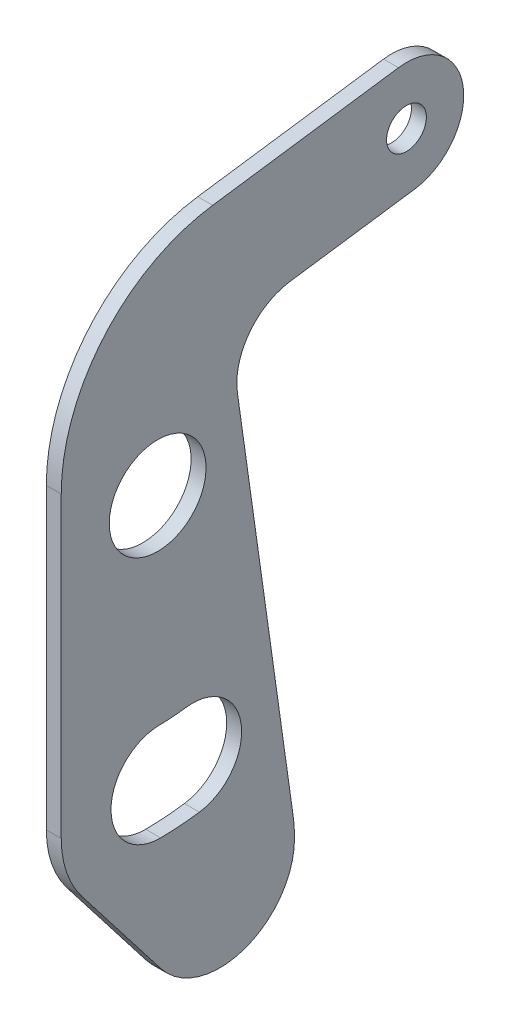
ISO-10303-21;
HEADER;
FILE_DESCRIPTION(('STEP AP214'),'2;1');
FILE_NAME('part.step','',(''),(''),'','','');
FILE_SCHEMA(('AUTOMOTIVE_DESIGN { 1 0 10303 214 1 1 1 1 }'));
ENDSEC;
DATA;
#1=APPLICATION_CONTEXT('core data for automotive mechanical design processes');
#2=APPLICATION_PROTOCOL_DEFINITION('international standard','automotive_design',2000,#1);
#3=PRODUCT_CONTEXT('',#1,'mechanical');
#4=PRODUCT('Part','Part','',(#3));
#5=PRODUCT_RELATED_PRODUCT_CATEGORY('part','',(#4));
#6=PRODUCT_DEFINITION_FORMATION('','',#4);
#7=PRODUCT_DEFINITION_CONTEXT('part definition',#1,'design');
#8=PRODUCT_DEFINITION('design','',#6,#7);
#9=PRODUCT_DEFINITION_SHAPE('','',#8);
#10=(LENGTH_UNIT() NAMED_UNIT(*) SI_UNIT(.MILLI.,.METRE.));
#11=(NAMED_UNIT(*) PLANE_ANGLE_UNIT() SI_UNIT($,.RADIAN.));
#12=(NAMED_UNIT(*) SI_UNIT($,.STERADIAN.) SOLID_ANGLE_UNIT());
#13=UNCERTAINTY_MEASURE_WITH_UNIT(LENGTH_MEASURE(1.E-05),#10,'distance_accuracy_value','');
#14=(GEOMETRIC_REPRESENTATION_CONTEXT(3) GLOBAL_UNCERTAINTY_ASSIGNED_CONTEXT((#13)) GLOBAL_UNIT_ASSIGNED_CONTEXT((#10,
#11,#12)) REPRESENTATION_CONTEXT('',''));
#15=CARTESIAN_POINT('',(0.,0.,0.));
#16=DIRECTION('',(0.,0.,1.));
#17=DIRECTION('',(1.,0.,0.));
#18=AXIS2_PLACEMENT_3D('',#15,#16,#17);
#19=CARTESIAN_POINT('',(1.524,-37.3168516753459,-6.35));
#20=DIRECTION('',(1.,0.,0.));
#21=DIRECTION('',(0.,0.,-1.));
#22=AXIS2_PLACEMENT_3D('',#19,#20,#21);
#23=PLANE('',#22);
#24=CARTESIAN_POINT('',(1.524,0.,0.));
#25=DIRECTION('',(1.,0.,0.));
#26=DIRECTION('',(0.,0.,-1.));
#27=AXIS2_PLACEMENT_3D('',#24,#25,#26);
#28=CIRCLE('',#27,30.4165);
#29=CARTESIAN_POINT('',(1.524,-30.414979175,-0.304161197913728));
#30=VERTEX_POINT('',#29);
#31=CARTESIAN_POINT('',(1.524,-30.1168569667699,-4.25891989747662));
#32=VERTEX_POINT('',#31);
#33=EDGE_CURVE('E152',#30,#32,#28,.T.);
#34=ORIENTED_EDGE('',*,*,#33,.F.);
#35=CARTESIAN_POINT('',(1.524,-25.39873,-0.253996824980157));
#36=DIRECTION('',(1.,0.,0.));
#37=DIRECTION('',(0.,0.,-1.));
#38=AXIS2_PLACEMENT_3D('',#35,#36,#37);
#39=CIRCLE('',#38,5.0165);
#40=CARTESIAN_POINT('',(1.524,-20.382480825,-0.203832452046569));
#41=VERTEX_POINT('',#40);
#42=EDGE_CURVE('E142',#41,#30,#39,.T.);
#43=ORIENTED_EDGE('',*,*,#42,.F.);
#44=CARTESIAN_POINT('',(1.524,0.,0.));
#45=DIRECTION('',(-1.,0.,0.));
#46=DIRECTION('',(0.,0.,-1.));
#47=AXIS2_PLACEMENT_3D('',#44,#45,#46);
#48=CIRCLE('',#47,20.3835);
#49=CARTESIAN_POINT('',(1.524,-20.1826953785661,-2.8540987204384));
#50=VERTEX_POINT('',#49);
#51=EDGE_CURVE('E168',#50,#41,#48,.T.);
#52=ORIENTED_EDGE('',*,*,#51,.F.);
#53=CARTESIAN_POINT('',(1.524,-25.149776172668,-3.55650930895751));
#54=DIRECTION('',(1.,0.,0.));
#55=DIRECTION('',(0.,0.,-1.));
#56=AXIS2_PLACEMENT_3D('',#53,#54,#55);
#57=CIRCLE('',#56,5.0165);
#58=EDGE_CURVE('E166',#32,#50,#57,.T.);
#59=ORIENTED_EDGE('',*,*,#58,.F.);
#60=EDGE_LOOP('',(#34,#43,#52,#59));
#61=FACE_BOUND('',#60,.T.);
#62=CARTESIAN_POINT('',(1.524,0.,0.));
#63=DIRECTION('',(1.,0.,0.));
#64=DIRECTION('',(0.,0.,-1.));
#65=AXIS2_PLACEMENT_3D('',#62,#63,#64);
#66=CIRCLE('',#65,4.9403);
#67=CARTESIAN_POINT('',(1.524,0.,4.9403));
#68=VERTEX_POINT('',#67);
#69=EDGE_CURVE('E186',#68,#68,#66,.T.);
#70=ORIENTED_EDGE('',*,*,#69,.F.);
#71=EDGE_LOOP('',(#70));
#72=FACE_BOUND('',#71,.T.);
#73=CARTESIAN_POINT('',(1.524,-37.3168516753459,-6.35));
#74=DIRECTION('',(1.,0.,0.));
#75=DIRECTION('',(0.,0.,-1.));
#76=AXIS2_PLACEMENT_3D('',#73,#74,#75);
#77=CIRCLE('',#76,7.62);
#78=CARTESIAN_POINT('',(1.524,-41.9819776295705,-0.324968893754983));
#79=VERTEX_POINT('',#78);
#80=CARTESIAN_POINT('',(1.524,-37.3168516753459,-13.97));
#81=VERTEX_POINT('',#80);
#82=EDGE_CURVE('E192',#79,#81,#77,.T.);
#83=ORIENTED_EDGE('',*,*,#82,.T.);
#84=CARTESIAN_POINT('',(1.524,-37.3168516753459,1.83807581099768));
#85=DIRECTION('',(1.,0.,0.));
#86=DIRECTION('',(0.,0.,-1.));
#87=AXIS2_PLACEMENT_3D('',#84,#85,#86);
#88=CIRCLE('',#87,15.8080758109977);
#89=CARTESIAN_POINT('',(1.524,-35.1034040856405,-13.8142694003078));
#90=VERTEX_POINT('',#89);
#91=EDGE_CURVE('E195',#81,#90,#88,.T.);
#92=ORIENTED_EDGE('',*,*,#91,.T.);
#93=DIRECTION('',(0.,0.990148668215275,0.14002005153376));
#94=VECTOR('',#93,1.);
#95=CARTESIAN_POINT('',(1.524,-35.1034040856405,-13.8142694003078));
#96=LINE('',#95,#94);
#97=CARTESIAN_POINT('',(1.524,4.99946213749055,-8.14319638322683));
#98=VERTEX_POINT('',#97);
#99=EDGE_CURVE('E198',#90,#98,#96,.T.);
#100=ORIENTED_EDGE('',*,*,#99,.T.);
#101=CARTESIAN_POINT('',(1.524,5.88858946472992,-14.4306404263938));
#102=DIRECTION('',(1.,0.,0.));
#103=DIRECTION('',(0.,0.,-1.));
#104=AXIS2_PLACEMENT_3D('',#101,#102,#103);
#105=CIRCLE('',#104,6.35);
#106=CARTESIAN_POINT('',(1.524,12.1760335078969,-13.5415130991545));
#107=VERTEX_POINT('',#106);
#108=EDGE_CURVE('E11',#98,#107,#105,.F.);
#109=ORIENTED_EDGE('',*,*,#108,.T.);
#110=DIRECTION('',(0.,0.14002005153376,-0.990148668215275));
#111=VECTOR('',#110,1.);
#112=CARTESIAN_POINT('',(1.524,11.2869061806575,-7.25406905598745));
#113=LINE('',#112,#111);
#114=CARTESIAN_POINT('',(1.524,13.9686551674441,-26.2179971410602));
#115=VERTEX_POINT('',#114);
#116=EDGE_CURVE('E200',#107,#115,#113,.T.);
#117=ORIENTED_EDGE('',*,*,#116,.T.);
#118=CARTESIAN_POINT('',(1.524,19.7531036871578,-25.4));
#119=DIRECTION('',(1.,0.,0.));
#120=DIRECTION('',(0.,0.,-1.));
#121=AXIS2_PLACEMENT_3D('',#118,#119,#120);
#122=CIRCLE('',#121,5.842);
#123=CARTESIAN_POINT('',(1.524,25.5375522068714,-24.5820028589398));
#124=VERTEX_POINT('',#123);
#125=EDGE_CURVE('E202',#115,#124,#122,.T.);
#126=ORIENTED_EDGE('',*,*,#125,.T.);
#127=DIRECTION('',(0.,-0.14002005153376,0.990148668215275));
#128=VECTOR('',#127,1.);
#129=CARTESIAN_POINT('',(1.524,25.5375522068714,-24.5820028589398));
#130=LINE('',#129,#128);
#131=CARTESIAN_POINT('',(1.524,22.8558032200848,-5.618074773867));
#132=VERTEX_POINT('',#131);
#133=EDGE_CURVE('E204',#124,#132,#130,.T.);
#134=ORIENTED_EDGE('',*,*,#133,.T.);
#135=CARTESIAN_POINT('',(1.524,5.0550734551283,-8.13533221109646));
#136=DIRECTION('',(1.,0.,0.));
#137=DIRECTION('',(0.,0.,1.));
#138=AXIS2_PLACEMENT_3D('',#135,#136,#137);
#139=CIRCLE('',#138,17.9778353861163);
#140=CARTESIAN_POINT('',(1.524,5.0550734551283,9.84250317501984));
#141=VERTEX_POINT('',#140);
#142=EDGE_CURVE('E206',#132,#141,#139,.T.);
#143=ORIENTED_EDGE('',*,*,#142,.T.);
#144=DIRECTION('',(0.,-1.,0.));
#145=VECTOR('',#144,1.);
#146=CARTESIAN_POINT('',(1.524,-25.39873,9.84250317501984));
#147=LINE('',#146,#145);
#148=CARTESIAN_POINT('',(1.524,-25.39873,9.84250317501985));
#149=VERTEX_POINT('',#148);
#150=EDGE_CURVE('E208',#141,#149,#147,.T.);
#151=ORIENTED_EDGE('',*,*,#150,.T.);
#152=CARTESIAN_POINT('',(1.524,-25.39873,-0.253996824980157));
#153=DIRECTION('',(1.,0.,0.));
#154=DIRECTION('',(0.,0.,-1.));
#155=AXIS2_PLACEMENT_3D('',#152,#153,#154);
#156=CIRCLE('',#155,10.0965);
#157=CARTESIAN_POINT('',(1.524,-31.5800218893476,7.7291693907945));
#158=VERTEX_POINT('',#157);
#159=EDGE_CURVE('E210',#149,#158,#156,.T.);
#160=ORIENTED_EDGE('',*,*,#159,.T.);
#161=DIRECTION('',(0.,-0.790686496882549,-0.612221253835248));
#162=VECTOR('',#161,1.);
#163=CARTESIAN_POINT('',(1.524,-41.9819776295705,-0.324968893754983));
#164=LINE('',#163,#162);
#165=EDGE_CURVE('E212',#158,#79,#164,.T.);
#166=ORIENTED_EDGE('',*,*,#165,.T.);
#167=EDGE_LOOP('',(#83,#92,#100,#109,#117,#126,#134,#143,#151,#160,#166));
#168=FACE_BOUND('',#167,.T.);
#169=CARTESIAN_POINT('',(1.524,19.7531036871578,-25.4));
#170=DIRECTION('',(1.,0.,0.));
#171=DIRECTION('',(0.,0.,-1.));
#172=AXIS2_PLACEMENT_3D('',#169,#170,#171);
#173=CIRCLE('',#172,2.032);
#174=CARTESIAN_POINT('',(1.524,19.7531036871578,-23.368));
#175=VERTEX_POINT('',#174);
#176=EDGE_CURVE('E175',#175,#175,#173,.T.);
#177=ORIENTED_EDGE('',*,*,#176,.F.);
#178=EDGE_LOOP('',(#177));
#179=FACE_BOUND('',#178,.T.);
#180=ADVANCED_FACE('F34',(#61,#72,#168,#179),#23,.T.);
#181=CARTESIAN_POINT('',(0.,-37.3168516753459,-6.35));
#182=DIRECTION('',(1.,0.,0.));
#183=DIRECTION('',(0.,0.,-1.));
#184=AXIS2_PLACEMENT_3D('',#181,#182,#183);
#185=PLANE('',#184);
#186=CARTESIAN_POINT('',(0.,0.,0.));
#187=DIRECTION('',(1.,0.,0.));
#188=DIRECTION('',(0.,0.,-1.));
#189=AXIS2_PLACEMENT_3D('',#186,#187,#188);
#190=CIRCLE('',#189,4.9403);
#191=CARTESIAN_POINT('',(0.,0.,4.9403));
#192=VERTEX_POINT('',#191);
#193=EDGE_CURVE('E160',#192,#192,#190,.T.);
#194=ORIENTED_EDGE('',*,*,#193,.T.);
#195=EDGE_LOOP('',(#194));
#196=FACE_BOUND('',#195,.T.);
#197=CARTESIAN_POINT('',(0.,-37.3168516753459,-6.35));
#198=DIRECTION('',(1.,0.,0.));
#199=DIRECTION('',(0.,0.,-1.));
#200=AXIS2_PLACEMENT_3D('',#197,#198,#199);
#201=CIRCLE('',#200,7.62);
#202=CARTESIAN_POINT('',(0.,-41.9819776295705,-0.324968893754983));
#203=VERTEX_POINT('',#202);
#204=CARTESIAN_POINT('',(0.,-37.3168516753459,-13.97));
#205=VERTEX_POINT('',#204);
#206=EDGE_CURVE('E189',#203,#205,#201,.T.);
#207=ORIENTED_EDGE('',*,*,#206,.F.);
#208=DIRECTION('',(0.,-0.790686496882549,-0.612221253835248));
#209=VECTOR('',#208,1.);
#210=CARTESIAN_POINT('',(0.,-41.9819776295705,-0.324968893754983));
#211=LINE('',#210,#209);
#212=CARTESIAN_POINT('',(0.,-31.5800218893476,7.7291693907945));
#213=VERTEX_POINT('',#212);
#214=EDGE_CURVE('E196',#213,#203,#211,.T.);
#215=ORIENTED_EDGE('',*,*,#214,.F.);
#216=CARTESIAN_POINT('',(0.,-25.39873,-0.253996824980157));
#217=DIRECTION('',(1.,0.,0.));
#218=DIRECTION('',(0.,0.,-1.));
#219=AXIS2_PLACEMENT_3D('',#216,#217,#218);
#220=CIRCLE('',#219,10.0965);
#221=CARTESIAN_POINT('',(0.,-25.39873,9.84250317501985));
#222=VERTEX_POINT('',#221);
#223=EDGE_CURVE('E231',#222,#213,#220,.T.);
#224=ORIENTED_EDGE('',*,*,#223,.F.);
#225=DIRECTION('',(0.,-1.,0.));
#226=VECTOR('',#225,1.);
#227=CARTESIAN_POINT('',(0.,-25.39873,9.84250317501984));
#228=LINE('',#227,#226);
#229=CARTESIAN_POINT('',(0.,5.0550734551283,9.84250317501984));
#230=VERTEX_POINT('',#229);
#231=EDGE_CURVE('E229',#230,#222,#228,.T.);
#232=ORIENTED_EDGE('',*,*,#231,.F.);
#233=CARTESIAN_POINT('',(0.,5.0550734551283,-8.13533221109646));
#234=DIRECTION('',(1.,0.,0.));
#235=DIRECTION('',(0.,0.,1.));
#236=AXIS2_PLACEMENT_3D('',#233,#234,#235);
#237=CIRCLE('',#236,17.9778353861163);
#238=CARTESIAN_POINT('',(0.,22.8558032200848,-5.618074773867));
#239=VERTEX_POINT('',#238);
#240=EDGE_CURVE('E227',#239,#230,#237,.T.);
#241=ORIENTED_EDGE('',*,*,#240,.F.);
#242=DIRECTION('',(0.,-0.14002005153376,0.990148668215275));
#243=VECTOR('',#242,1.);
#244=CARTESIAN_POINT('',(0.,25.5375522068714,-24.5820028589398));
#245=LINE('',#244,#243);
#246=CARTESIAN_POINT('',(0.,25.5375522068714,-24.5820028589398));
#247=VERTEX_POINT('',#246);
#248=EDGE_CURVE('E225',#247,#239,#245,.T.);
#249=ORIENTED_EDGE('',*,*,#248,.F.);
#250=CARTESIAN_POINT('',(0.,19.7531036871578,-25.4));
#251=DIRECTION('',(1.,0.,0.));
#252=DIRECTION('',(0.,0.,-1.));
#253=AXIS2_PLACEMENT_3D('',#250,#251,#252);
#254=CIRCLE('',#253,5.842);
#255=CARTESIAN_POINT('',(0.,13.9686551674441,-26.2179971410602));
#256=VERTEX_POINT('',#255);
#257=EDGE_CURVE('E223',#256,#247,#254,.T.);
#258=ORIENTED_EDGE('',*,*,#257,.F.);
#259=DIRECTION('',(0.,0.14002005153376,-0.990148668215275));
#260=VECTOR('',#259,1.);
#261=CARTESIAN_POINT('',(0.,11.2869061806575,-7.25406905598745));
#262=LINE('',#261,#260);
#263=CARTESIAN_POINT('',(0.,12.1760335078969,-13.5415130991545));
#264=VERTEX_POINT('',#263);
#265=EDGE_CURVE('E221',#264,#256,#262,.T.);
#266=ORIENTED_EDGE('',*,*,#265,.F.);
#267=CARTESIAN_POINT('',(0.,5.88858946472992,-14.4306404263938));
#268=DIRECTION('',(1.,0.,0.));
#269=DIRECTION('',(0.,0.,-1.));
#270=AXIS2_PLACEMENT_3D('',#267,#268,#269);
#271=CIRCLE('',#270,6.35);
#272=CARTESIAN_POINT('',(0.,4.99946213749055,-8.14319638322683));
#273=VERTEX_POINT('',#272);
#274=EDGE_CURVE('E42',#264,#273,#271,.T.);
#275=ORIENTED_EDGE('',*,*,#274,.T.);
#276=DIRECTION('',(0.,0.990148668215275,0.14002005153376));
#277=VECTOR('',#276,1.);
#278=CARTESIAN_POINT('',(0.,-35.1034040856405,-13.8142694003078));
#279=LINE('',#278,#277);
#280=CARTESIAN_POINT('',(0.,-35.1034040856405,-13.8142694003078));
#281=VERTEX_POINT('',#280);
#282=EDGE_CURVE('E219',#281,#273,#279,.T.);
#283=ORIENTED_EDGE('',*,*,#282,.F.);
#284=CARTESIAN_POINT('',(0.,-37.3168516753459,1.83807581099768));
#285=DIRECTION('',(1.,0.,0.));
#286=DIRECTION('',(0.,0.,-1.));
#287=AXIS2_PLACEMENT_3D('',#284,#285,#286);
#288=CIRCLE('',#287,15.8080758109977);
#289=EDGE_CURVE('E217',#205,#281,#288,.T.);
#290=ORIENTED_EDGE('',*,*,#289,.F.);
#291=EDGE_LOOP('',(#207,#215,#224,#232,#241,#249,#258,#266,#275,#283,#290));
#292=FACE_BOUND('',#291,.T.);
#293=CARTESIAN_POINT('',(0.,-25.39873,-0.253996824980157));
#294=DIRECTION('',(1.,0.,0.));
#295=DIRECTION('',(0.,0.,-1.));
#296=AXIS2_PLACEMENT_3D('',#293,#294,#295);
#297=CIRCLE('',#296,5.0165);
#298=CARTESIAN_POINT('',(0.,-20.382480825,-0.203832452046569));
#299=VERTEX_POINT('',#298);
#300=CARTESIAN_POINT('',(0.,-30.414979175,-0.304161197913728));
#301=VERTEX_POINT('',#300);
#302=EDGE_CURVE('E173',#299,#301,#297,.T.);
#303=ORIENTED_EDGE('',*,*,#302,.T.);
#304=CARTESIAN_POINT('',(0.,0.,0.));
#305=DIRECTION('',(1.,0.,0.));
#306=DIRECTION('',(0.,0.,-1.));
#307=AXIS2_PLACEMENT_3D('',#304,#305,#306);
#308=CIRCLE('',#307,30.4165);
#309=CARTESIAN_POINT('',(0.,-30.1168569667699,-4.25891989747662));
#310=VERTEX_POINT('',#309);
#311=EDGE_CURVE('E159',#301,#310,#308,.T.);
#312=ORIENTED_EDGE('',*,*,#311,.T.);
#313=CARTESIAN_POINT('',(0.,-25.149776172668,-3.55650930895751));
#314=DIRECTION('',(1.,0.,0.));
#315=DIRECTION('',(0.,0.,-1.));
#316=AXIS2_PLACEMENT_3D('',#313,#314,#315);
#317=CIRCLE('',#316,5.0165);
#318=CARTESIAN_POINT('',(0.,-20.1826953785661,-2.8540987204384));
#319=VERTEX_POINT('',#318);
#320=EDGE_CURVE('E177',#310,#319,#317,.T.);
#321=ORIENTED_EDGE('',*,*,#320,.T.);
#322=CARTESIAN_POINT('',(0.,0.,0.));
#323=DIRECTION('',(-1.,0.,0.));
#324=DIRECTION('',(0.,0.,-1.));
#325=AXIS2_PLACEMENT_3D('',#322,#323,#324);
#326=CIRCLE('',#325,20.3835);
#327=EDGE_CURVE('E153',#319,#299,#326,.T.);
#328=ORIENTED_EDGE('',*,*,#327,.T.);
#329=EDGE_LOOP('',(#303,#312,#321,#328));
#330=FACE_BOUND('',#329,.T.);
#331=CARTESIAN_POINT('',(0.,19.7531036871578,-25.4));
#332=DIRECTION('',(1.,0.,0.));
#333=DIRECTION('',(0.,0.,-1.));
#334=AXIS2_PLACEMENT_3D('',#331,#332,#333);
#335=CIRCLE('',#334,2.032);
#336=CARTESIAN_POINT('',(0.,19.7531036871578,-23.368));
#337=VERTEX_POINT('',#336);
#338=EDGE_CURVE('E477',#337,#337,#335,.T.);
#339=ORIENTED_EDGE('',*,*,#338,.T.);
#340=EDGE_LOOP('',(#339));
#341=FACE_BOUND('',#340,.T.);
#342=ADVANCED_FACE('F272',(#196,#292,#330,#341),#185,.F.);
#343=CARTESIAN_POINT('',(1.524,-37.3168516753459,-6.35));
#344=DIRECTION('',(-1.,0.,0.));
#345=DIRECTION('',(0.,0.,1.));
#346=AXIS2_PLACEMENT_3D('',#343,#344,#345);
#347=CYLINDRICAL_SURFACE('',#346,7.62);
#348=ORIENTED_EDGE('',*,*,#206,.T.);
#349=DIRECTION('',(-1.,0.,0.));
#350=VECTOR('',#349,1.);
#351=CARTESIAN_POINT('',(1.524,-37.3168516753459,-13.97));
#352=LINE('',#351,#350);
#353=EDGE_CURVE('E257',#81,#205,#352,.T.);
#354=ORIENTED_EDGE('',*,*,#353,.F.);
#355=ORIENTED_EDGE('',*,*,#82,.F.);
#356=DIRECTION('',(-1.,0.,0.));
#357=VECTOR('',#356,1.);
#358=CARTESIAN_POINT('',(1.524,-41.9819776295705,-0.324968893754983));
#359=LINE('',#358,#357);
#360=EDGE_CURVE('E214',#79,#203,#359,.T.);
#361=ORIENTED_EDGE('',*,*,#360,.T.);
#362=EDGE_LOOP('',(#348,#354,#355,#361));
#363=FACE_BOUND('',#362,.T.);
#364=ADVANCED_FACE('F301',(#363),#347,.T.);
#365=CARTESIAN_POINT('',(1.524,-37.3168516753459,1.83807581099768));
#366=DIRECTION('',(-1.,0.,0.));
#367=DIRECTION('',(0.,0.,1.));
#368=AXIS2_PLACEMENT_3D('',#365,#366,#367);
#369=CYLINDRICAL_SURFACE('',#368,15.8080758109977);
#370=ORIENTED_EDGE('',*,*,#289,.T.);
#371=DIRECTION('',(-1.,0.,0.));
#372=VECTOR('',#371,1.);
#373=CARTESIAN_POINT('',(1.524,-35.1034040856405,-13.8142694003078));
#374=LINE('',#373,#372);
#375=EDGE_CURVE('E254',#90,#281,#374,.T.);
#376=ORIENTED_EDGE('',*,*,#375,.F.);
#377=ORIENTED_EDGE('',*,*,#91,.F.);
#378=ORIENTED_EDGE('',*,*,#353,.T.);
#379=EDGE_LOOP('',(#370,#376,#377,#378));
#380=FACE_BOUND('',#379,.T.);
#381=ADVANCED_FACE('F333',(#380),#369,.T.);
#382=CARTESIAN_POINT('',(1.524,-35.1034040856405,-13.8142694003078));
#383=DIRECTION('',(0.,-0.14002005153376,0.990148668215275));
#384=DIRECTION('',(0.,-0.990148668215275,-0.14002005153376));
#385=AXIS2_PLACEMENT_3D('',#382,#383,#384);
#386=PLANE('',#385);
#387=ORIENTED_EDGE('',*,*,#282,.T.);
#388=DIRECTION('',(-1.,0.,0.));
#389=VECTOR('',#388,1.);
#390=CARTESIAN_POINT('',(1.524,4.99946213749054,-8.14319638322683));
#391=LINE('',#390,#389);
#392=EDGE_CURVE('E49',#273,#98,#391,.F.);
#393=ORIENTED_EDGE('',*,*,#392,.T.);
#394=ORIENTED_EDGE('',*,*,#99,.F.);
#395=ORIENTED_EDGE('',*,*,#375,.T.);
#396=EDGE_LOOP('',(#387,#393,#394,#395));
#397=FACE_BOUND('',#396,.T.);
#398=ADVANCED_FACE('F330',(#397),#386,.F.);
#399=CARTESIAN_POINT('',(1.524,11.2869061806575,-7.25406905598745));
#400=DIRECTION('',(0.,0.990148668215275,0.14002005153376));
#401=DIRECTION('',(0.,-0.14002005153376,0.990148668215275));
#402=AXIS2_PLACEMENT_3D('',#399,#400,#401);
#403=PLANE('',#402);
#404=ORIENTED_EDGE('',*,*,#116,.F.);
#405=DIRECTION('',(-1.,0.,0.));
#406=VECTOR('',#405,1.);
#407=CARTESIAN_POINT('',(0.,12.1760335078969,-13.5415130991545));
#408=LINE('',#407,#406);
#409=EDGE_CURVE('E260',#107,#264,#408,.T.);
#410=ORIENTED_EDGE('',*,*,#409,.T.);
#411=ORIENTED_EDGE('',*,*,#265,.T.);
#412=DIRECTION('',(-1.,0.,0.));
#413=VECTOR('',#412,1.);
#414=CARTESIAN_POINT('',(1.524,13.9686551674441,-26.2179971410602));
#415=LINE('',#414,#413);
#416=EDGE_CURVE('E251',#115,#256,#415,.T.);
#417=ORIENTED_EDGE('',*,*,#416,.F.);
#418=EDGE_LOOP('',(#404,#410,#411,#417));
#419=FACE_BOUND('',#418,.T.);
#420=ADVANCED_FACE('F266',(#419),#403,.F.);
#421=CARTESIAN_POINT('',(1.524,19.7531036871578,-25.4));
#422=DIRECTION('',(-1.,0.,0.));
#423=DIRECTION('',(0.,0.,1.));
#424=AXIS2_PLACEMENT_3D('',#421,#422,#423);
#425=CYLINDRICAL_SURFACE('',#424,5.842);
#426=ORIENTED_EDGE('',*,*,#257,.T.);
#427=DIRECTION('',(-1.,0.,0.));
#428=VECTOR('',#427,1.);
#429=CARTESIAN_POINT('',(1.524,25.5375522068714,-24.5820028589398));
#430=LINE('',#429,#428);
#431=EDGE_CURVE('E248',#124,#247,#430,.T.);
#432=ORIENTED_EDGE('',*,*,#431,.F.);
#433=ORIENTED_EDGE('',*,*,#125,.F.);
#434=ORIENTED_EDGE('',*,*,#416,.T.);
#435=EDGE_LOOP('',(#426,#432,#433,#434));
#436=FACE_BOUND('',#435,.T.);
#437=ADVANCED_FACE('F278',(#436),#425,.T.);
#438=CARTESIAN_POINT('',(1.524,25.5375522068714,-24.5820028589398));
#439=DIRECTION('',(0.,-0.990148668215275,-0.14002005153376));
#440=DIRECTION('',(0.,0.14002005153376,-0.990148668215275));
#441=AXIS2_PLACEMENT_3D('',#438,#439,#440);
#442=PLANE('',#441);
#443=ORIENTED_EDGE('',*,*,#248,.T.);
#444=DIRECTION('',(-1.,0.,0.));
#445=VECTOR('',#444,1.);
#446=CARTESIAN_POINT('',(1.524,22.8558032200848,-5.618074773867));
#447=LINE('',#446,#445);
#448=EDGE_CURVE('E245',#132,#239,#447,.T.);
#449=ORIENTED_EDGE('',*,*,#448,.F.);
#450=ORIENTED_EDGE('',*,*,#133,.F.);
#451=ORIENTED_EDGE('',*,*,#431,.T.);
#452=EDGE_LOOP('',(#443,#449,#450,#451));
#453=FACE_BOUND('',#452,.T.);
#454=ADVANCED_FACE('F282',(#453),#442,.F.);
#455=CARTESIAN_POINT('',(1.524,5.0550734551283,-8.13533221109646));
#456=DIRECTION('',(-1.,0.,0.));
#457=DIRECTION('',(0.,0.,1.));
#458=AXIS2_PLACEMENT_3D('',#455,#456,#457);
#459=CYLINDRICAL_SURFACE('',#458,17.9778353861163);
#460=ORIENTED_EDGE('',*,*,#240,.T.);
#461=DIRECTION('',(-1.,0.,0.));
#462=VECTOR('',#461,1.);
#463=CARTESIAN_POINT('',(1.524,5.0550734551283,9.84250317501984));
#464=LINE('',#463,#462);
#465=EDGE_CURVE('E242',#141,#230,#464,.T.);
#466=ORIENTED_EDGE('',*,*,#465,.F.);
#467=ORIENTED_EDGE('',*,*,#142,.F.);
#468=ORIENTED_EDGE('',*,*,#448,.T.);
#469=EDGE_LOOP('',(#460,#466,#467,#468));
#470=FACE_BOUND('',#469,.T.);
#471=ADVANCED_FACE('F319',(#470),#459,.T.);
#472=CARTESIAN_POINT('',(1.524,-25.39873,9.84250317501984));
#473=DIRECTION('',(0.,0.,-1.));
#474=DIRECTION('',(-1.,0.,0.));
#475=AXIS2_PLACEMENT_3D('',#472,#473,#474);
#476=PLANE('',#475);
#477=ORIENTED_EDGE('',*,*,#231,.T.);
#478=DIRECTION('',(-1.,0.,0.));
#479=VECTOR('',#478,1.);
#480=CARTESIAN_POINT('',(1.524,-25.39873,9.84250317501985));
#481=LINE('',#480,#479);
#482=EDGE_CURVE('E239',#149,#222,#481,.T.);
#483=ORIENTED_EDGE('',*,*,#482,.F.);
#484=ORIENTED_EDGE('',*,*,#150,.F.);
#485=ORIENTED_EDGE('',*,*,#465,.T.);
#486=EDGE_LOOP('',(#477,#483,#484,#485));
#487=FACE_BOUND('',#486,.T.);
#488=ADVANCED_FACE('F315',(#487),#476,.F.);
#489=CARTESIAN_POINT('',(1.524,-25.39873,-0.253996824980157));
#490=DIRECTION('',(-1.,0.,0.));
#491=DIRECTION('',(0.,0.,1.));
#492=AXIS2_PLACEMENT_3D('',#489,#490,#491);
#493=CYLINDRICAL_SURFACE('',#492,10.0965);
#494=ORIENTED_EDGE('',*,*,#223,.T.);
#495=DIRECTION('',(-1.,0.,0.));
#496=VECTOR('',#495,1.);
#497=CARTESIAN_POINT('',(1.524,-31.5800218893476,7.7291693907945));
#498=LINE('',#497,#496);
#499=EDGE_CURVE('E236',#158,#213,#498,.T.);
#500=ORIENTED_EDGE('',*,*,#499,.F.);
#501=ORIENTED_EDGE('',*,*,#159,.F.);
#502=ORIENTED_EDGE('',*,*,#482,.T.);
#503=EDGE_LOOP('',(#494,#500,#501,#502));
#504=FACE_BOUND('',#503,.T.);
#505=ADVANCED_FACE('F311',(#504),#493,.T.);
#506=CARTESIAN_POINT('',(1.524,-41.9819776295705,-0.324968893754983));
#507=DIRECTION('',(0.,0.612221253835248,-0.790686496882549));
#508=DIRECTION('',(0.,0.790686496882549,0.612221253835248));
#509=AXIS2_PLACEMENT_3D('',#506,#507,#508);
#510=PLANE('',#509);
#511=ORIENTED_EDGE('',*,*,#214,.T.);
#512=ORIENTED_EDGE('',*,*,#360,.F.);
#513=ORIENTED_EDGE('',*,*,#165,.F.);
#514=ORIENTED_EDGE('',*,*,#499,.T.);
#515=EDGE_LOOP('',(#511,#512,#513,#514));
#516=FACE_BOUND('',#515,.T.);
#517=ADVANCED_FACE('F308',(#516),#510,.F.);
#518=CARTESIAN_POINT('',(1.524,0.,0.));
#519=DIRECTION('',(-1.,0.,0.));
#520=DIRECTION('',(0.,0.,1.));
#521=AXIS2_PLACEMENT_3D('',#518,#519,#520);
#522=CYLINDRICAL_SURFACE('',#521,4.9403);
#523=CARTESIAN_POINT('',(1.524,0.,4.9403));
#524=CARTESIAN_POINT('',(1.508125,0.,4.9403));
#525=CARTESIAN_POINT('',(1.49225,0.,4.9403));
#526=CARTESIAN_POINT('',(1.4605,0.,4.9403));
#527=CARTESIAN_POINT('',(1.444625,0.,4.9403));
#528=CARTESIAN_POINT('',(1.412875,0.,4.9403));
#529=CARTESIAN_POINT('',(1.397,0.,4.9403));
#530=CARTESIAN_POINT('',(1.36525,0.,4.9403));
#531=CARTESIAN_POINT('',(1.349375,0.,4.9403));
#532=CARTESIAN_POINT('',(1.317625,0.,4.9403));
#533=CARTESIAN_POINT('',(1.30175,0.,4.9403));
#534=CARTESIAN_POINT('',(1.27,0.,4.9403));
#535=CARTESIAN_POINT('',(1.254125,0.,4.9403));
#536=CARTESIAN_POINT('',(1.222375,0.,4.9403));
#537=CARTESIAN_POINT('',(1.2065,0.,4.9403));
#538=CARTESIAN_POINT('',(1.17475,0.,4.9403));
#539=CARTESIAN_POINT('',(1.158875,0.,4.9403));
#540=CARTESIAN_POINT('',(1.127125,0.,4.9403));
#541=CARTESIAN_POINT('',(1.11125,0.,4.9403));
#542=CARTESIAN_POINT('',(1.0795,0.,4.9403));
#543=CARTESIAN_POINT('',(1.063625,0.,4.9403));
#544=CARTESIAN_POINT('',(1.031875,0.,4.9403));
#545=CARTESIAN_POINT('',(1.016,0.,4.9403));
#546=CARTESIAN_POINT('',(0.98425,0.,4.9403));
#547=CARTESIAN_POINT('',(0.968375,0.,4.9403));
#548=CARTESIAN_POINT('',(0.936625,0.,4.9403));
#549=CARTESIAN_POINT('',(0.92075,0.,4.9403));
#550=CARTESIAN_POINT('',(0.889,0.,4.9403));
#551=CARTESIAN_POINT('',(0.873125,0.,4.9403));
#552=CARTESIAN_POINT('',(0.841375,0.,4.9403));
#553=CARTESIAN_POINT('',(0.8255,0.,4.9403));
#554=CARTESIAN_POINT('',(0.79375,0.,4.9403));
#555=CARTESIAN_POINT('',(0.777875,0.,4.9403));
#556=CARTESIAN_POINT('',(0.746125,0.,4.9403));
#557=CARTESIAN_POINT('',(0.73025,0.,4.9403));
#558=CARTESIAN_POINT('',(0.6985,0.,4.9403));
#559=CARTESIAN_POINT('',(0.682625,0.,4.9403));
#560=CARTESIAN_POINT('',(0.650875,0.,4.9403));
#561=CARTESIAN_POINT('',(0.635,0.,4.9403));
#562=CARTESIAN_POINT('',(0.60325,0.,4.9403));
#563=CARTESIAN_POINT('',(0.587375,0.,4.9403));
#564=CARTESIAN_POINT('',(0.555625,0.,4.9403));
#565=CARTESIAN_POINT('',(0.53975,0.,4.9403));
#566=CARTESIAN_POINT('',(0.508,0.,4.9403));
#567=CARTESIAN_POINT('',(0.492125,0.,4.9403));
#568=CARTESIAN_POINT('',(0.460375,0.,4.9403));
#569=CARTESIAN_POINT('',(0.4445,0.,4.9403));
#570=CARTESIAN_POINT('',(0.41275,0.,4.9403));
#571=CARTESIAN_POINT('',(0.396875,0.,4.9403));
#572=CARTESIAN_POINT('',(0.365125,0.,4.9403));
#573=CARTESIAN_POINT('',(0.34925,0.,4.9403));
#574=CARTESIAN_POINT('',(0.3175,0.,4.9403));
#575=CARTESIAN_POINT('',(0.301625,0.,4.9403));
#576=CARTESIAN_POINT('',(0.269875,0.,4.9403));
#577=CARTESIAN_POINT('',(0.254,0.,4.9403));
#578=CARTESIAN_POINT('',(0.22225,0.,4.9403));
#579=CARTESIAN_POINT('',(0.206375,0.,4.9403));
#580=CARTESIAN_POINT('',(0.174625,0.,4.9403));
#581=CARTESIAN_POINT('',(0.15875,0.,4.9403));
#582=CARTESIAN_POINT('',(0.127,0.,4.9403));
#583=CARTESIAN_POINT('',(0.111125,0.,4.9403));
#584=CARTESIAN_POINT('',(0.079375,0.,4.9403));
#585=CARTESIAN_POINT('',(0.0635,0.,4.9403));
#586=CARTESIAN_POINT('',(0.0317499999999999,0.,4.9403));
#587=CARTESIAN_POINT('',(0.015875,0.,4.9403));
#588=CARTESIAN_POINT('',(0.,0.,4.9403));
#589=B_SPLINE_CURVE_WITH_KNOTS('',3,(#523,#524,#525,#526,#527,#528,#529,#530,#531,#532,#533,
#534,#535,#536,#537,#538,#539,#540,#541,#542,#543,#544,#545,#546,#547,#548,#549,#550,#551,#552,
#553,#554,#555,#556,#557,#558,#559,#560,#561,#562,#563,#564,#565,#566,#567,#568,#569,#570,#571,
#572,#573,#574,#575,#576,#577,#578,#579,#580,#581,#582,#583,#584,#585,#586,#587,#588),
.UNSPECIFIED.,.F.,.F.,(4,2,2,2,2,2,2,2,2,2,2,2,2,2,2,2,2,2,2,2,2,2,2,2,2,2,2,2,2,2,2,2,4),(0.,
0.0476250000000001,0.0952500000000001,0.142875,0.1905,0.238125,0.28575,0.333375,0.381,0.428625,
0.47625,0.523875,0.5715,0.619125,0.66675,0.714375,0.762,0.809625,0.85725,0.904875,0.9525,
1.000125,1.04775,1.095375,1.143,1.190625,1.23825,1.285875,1.3335,1.381125,1.42875,1.476375,
1.524),.UNSPECIFIED.);
#590=EDGE_CURVE('BSEAM305',#68,#192,#589,.T.);
#591=ORIENTED_EDGE('',*,*,#69,.T.);
#592=ORIENTED_EDGE('',*,*,#193,.F.);
#593=ORIENTED_EDGE('',*,*,#590,.T.);
#594=ORIENTED_EDGE('',*,*,#590,.F.);
#595=EDGE_LOOP('',(#591,#593,#592,#594));
#596=FACE_BOUND('',#595,.T.);
#597=ADVANCED_FACE('F305',(#596),#522,.F.);
#598=CARTESIAN_POINT('',(1.524,-25.39873,-0.253996824980157));
#599=DIRECTION('',(-1.,0.,0.));
#600=DIRECTION('',(0.,0.,1.));
#601=AXIS2_PLACEMENT_3D('',#598,#599,#600);
#602=CYLINDRICAL_SURFACE('',#601,5.0165);
#603=ORIENTED_EDGE('',*,*,#302,.F.);
#604=DIRECTION('',(-1.,0.,0.));
#605=VECTOR('',#604,1.);
#606=CARTESIAN_POINT('',(1.524,-20.382480825,-0.203832452046569));
#607=LINE('',#606,#605);
#608=EDGE_CURVE('E148',#41,#299,#607,.T.);
#609=ORIENTED_EDGE('',*,*,#608,.F.);
#610=ORIENTED_EDGE('',*,*,#42,.T.);
#611=DIRECTION('',(-1.,0.,0.));
#612=VECTOR('',#611,1.);
#613=CARTESIAN_POINT('',(1.524,-30.414979175,-0.304161197913728));
#614=LINE('',#613,#612);
#615=EDGE_CURVE('E145',#30,#301,#614,.T.);
#616=ORIENTED_EDGE('',*,*,#615,.T.);
#617=EDGE_LOOP('',(#603,#609,#610,#616));
#618=FACE_BOUND('',#617,.T.);
#619=ADVANCED_FACE('F144',(#618),#602,.F.);
#620=CARTESIAN_POINT('',(1.524,0.,0.));
#621=DIRECTION('',(-1.,0.,0.));
#622=DIRECTION('',(0.,0.,1.));
#623=AXIS2_PLACEMENT_3D('',#620,#621,#622);
#624=CYLINDRICAL_SURFACE('',#623,30.4165);
#625=ORIENTED_EDGE('',*,*,#311,.F.);
#626=ORIENTED_EDGE('',*,*,#615,.F.);
#627=ORIENTED_EDGE('',*,*,#33,.T.);
#628=DIRECTION('',(-1.,0.,0.));
#629=VECTOR('',#628,1.);
#630=CARTESIAN_POINT('',(1.524,-30.1168569667699,-4.25891989747662));
#631=LINE('',#630,#629);
#632=EDGE_CURVE('E161',#32,#310,#631,.T.);
#633=ORIENTED_EDGE('',*,*,#632,.T.);
#634=EDGE_LOOP('',(#625,#626,#627,#633));
#635=FACE_BOUND('',#634,.T.);
#636=ADVANCED_FACE('F156',(#635),#624,.F.);
#637=CARTESIAN_POINT('',(1.524,-25.149776172668,-3.55650930895751));
#638=DIRECTION('',(-1.,0.,0.));
#639=DIRECTION('',(0.,0.,1.));
#640=AXIS2_PLACEMENT_3D('',#637,#638,#639);
#641=CYLINDRICAL_SURFACE('',#640,5.0165);
#642=ORIENTED_EDGE('',*,*,#320,.F.);
#643=ORIENTED_EDGE('',*,*,#632,.F.);
#644=ORIENTED_EDGE('',*,*,#58,.T.);
#645=DIRECTION('',(-1.,0.,0.));
#646=VECTOR('',#645,1.);
#647=CARTESIAN_POINT('',(1.524,-20.1826953785661,-2.8540987204384));
#648=LINE('',#647,#646);
#649=EDGE_CURVE('E183',#50,#319,#648,.T.);
#650=ORIENTED_EDGE('',*,*,#649,.T.);
#651=EDGE_LOOP('',(#642,#643,#644,#650));
#652=FACE_BOUND('',#651,.T.);
#653=ADVANCED_FACE('F407',(#652),#641,.F.);
#654=CARTESIAN_POINT('',(1.524,0.,0.));
#655=DIRECTION('',(-1.,0.,0.));
#656=DIRECTION('',(0.,0.,1.));
#657=AXIS2_PLACEMENT_3D('',#654,#655,#656);
#658=CYLINDRICAL_SURFACE('',#657,20.3835);
#659=ORIENTED_EDGE('',*,*,#327,.F.);
#660=ORIENTED_EDGE('',*,*,#649,.F.);
#661=ORIENTED_EDGE('',*,*,#51,.T.);
#662=ORIENTED_EDGE('',*,*,#608,.T.);
#663=EDGE_LOOP('',(#659,#660,#661,#662));
#664=FACE_BOUND('',#663,.T.);
#665=ADVANCED_FACE('F293',(#664),#658,.T.);
#666=CARTESIAN_POINT('',(1.524,19.7531036871578,-25.4));
#667=DIRECTION('',(-1.,0.,0.));
#668=DIRECTION('',(0.,0.,1.));
#669=AXIS2_PLACEMENT_3D('',#666,#667,#668);
#670=CYLINDRICAL_SURFACE('',#669,2.032);
#671=CARTESIAN_POINT('',(1.524,19.7531036871578,-23.368));
#672=CARTESIAN_POINT('',(1.508125,19.7531036871578,-23.368));
#673=CARTESIAN_POINT('',(1.49225,19.7531036871578,-23.368));
#674=CARTESIAN_POINT('',(1.4605,19.7531036871578,-23.368));
#675=CARTESIAN_POINT('',(1.444625,19.7531036871578,-23.368));
#676=CARTESIAN_POINT('',(1.412875,19.7531036871578,-23.368));
#677=CARTESIAN_POINT('',(1.397,19.7531036871578,-23.368));
#678=CARTESIAN_POINT('',(1.36525,19.7531036871578,-23.368));
#679=CARTESIAN_POINT('',(1.349375,19.7531036871578,-23.368));
#680=CARTESIAN_POINT('',(1.317625,19.7531036871578,-23.368));
#681=CARTESIAN_POINT('',(1.30175,19.7531036871578,-23.368));
#682=CARTESIAN_POINT('',(1.27,19.7531036871578,-23.368));
#683=CARTESIAN_POINT('',(1.254125,19.7531036871578,-23.368));
#684=CARTESIAN_POINT('',(1.222375,19.7531036871578,-23.368));
#685=CARTESIAN_POINT('',(1.2065,19.7531036871578,-23.368));
#686=CARTESIAN_POINT('',(1.17475,19.7531036871578,-23.368));
#687=CARTESIAN_POINT('',(1.158875,19.7531036871578,-23.368));
#688=CARTESIAN_POINT('',(1.127125,19.7531036871578,-23.368));
#689=CARTESIAN_POINT('',(1.11125,19.7531036871578,-23.368));
#690=CARTESIAN_POINT('',(1.0795,19.7531036871578,-23.368));
#691=CARTESIAN_POINT('',(1.063625,19.7531036871578,-23.368));
#692=CARTESIAN_POINT('',(1.031875,19.7531036871578,-23.368));
#693=CARTESIAN_POINT('',(1.016,19.7531036871578,-23.368));
#694=CARTESIAN_POINT('',(0.98425,19.7531036871578,-23.368));
#695=CARTESIAN_POINT('',(0.968375,19.7531036871578,-23.368));
#696=CARTESIAN_POINT('',(0.936625,19.7531036871578,-23.368));
#697=CARTESIAN_POINT('',(0.92075,19.7531036871578,-23.368));
#698=CARTESIAN_POINT('',(0.889,19.7531036871578,-23.368));
#699=CARTESIAN_POINT('',(0.873125,19.7531036871578,-23.368));
#700=CARTESIAN_POINT('',(0.841375,19.7531036871578,-23.368));
#701=CARTESIAN_POINT('',(0.8255,19.7531036871578,-23.368));
#702=CARTESIAN_POINT('',(0.79375,19.7531036871578,-23.368));
#703=CARTESIAN_POINT('',(0.777875,19.7531036871578,-23.368));
#704=CARTESIAN_POINT('',(0.746125,19.7531036871578,-23.368));
#705=CARTESIAN_POINT('',(0.73025,19.7531036871578,-23.368));
#706=CARTESIAN_POINT('',(0.6985,19.7531036871578,-23.368));
#707=CARTESIAN_POINT('',(0.682625,19.7531036871578,-23.368));
#708=CARTESIAN_POINT('',(0.650875,19.7531036871578,-23.368));
#709=CARTESIAN_POINT('',(0.635,19.7531036871578,-23.368));
#710=CARTESIAN_POINT('',(0.60325,19.7531036871578,-23.368));
#711=CARTESIAN_POINT('',(0.587375,19.7531036871578,-23.368));
#712=CARTESIAN_POINT('',(0.555625,19.7531036871578,-23.368));
#713=CARTESIAN_POINT('',(0.53975,19.7531036871578,-23.368));
#714=CARTESIAN_POINT('',(0.508,19.7531036871578,-23.368));
#715=CARTESIAN_POINT('',(0.492125,19.7531036871578,-23.368));
#716=CARTESIAN_POINT('',(0.460375,19.7531036871578,-23.368));
#717=CARTESIAN_POINT('',(0.4445,19.7531036871578,-23.368));
#718=CARTESIAN_POINT('',(0.41275,19.7531036871578,-23.368));
#719=CARTESIAN_POINT('',(0.396875,19.7531036871578,-23.368));
#720=CARTESIAN_POINT('',(0.365125,19.7531036871578,-23.368));
#721=CARTESIAN_POINT('',(0.34925,19.7531036871578,-23.368));
#722=CARTESIAN_POINT('',(0.3175,19.7531036871578,-23.368));
#723=CARTESIAN_POINT('',(0.301625,19.7531036871578,-23.368));
#724=CARTESIAN_POINT('',(0.269875,19.7531036871578,-23.368));
#725=CARTESIAN_POINT('',(0.254,19.7531036871578,-23.368));
#726=CARTESIAN_POINT('',(0.22225,19.7531036871578,-23.368));
#727=CARTESIAN_POINT('',(0.206375,19.7531036871578,-23.368));
#728=CARTESIAN_POINT('',(0.174625,19.7531036871578,-23.368));
#729=CARTESIAN_POINT('',(0.15875,19.7531036871578,-23.368));
#730=CARTESIAN_POINT('',(0.127,19.7531036871578,-23.368));
#731=CARTESIAN_POINT('',(0.111125,19.7531036871578,-23.368));
#732=CARTESIAN_POINT('',(0.079375,19.7531036871578,-23.368));
#733=CARTESIAN_POINT('',(0.0635,19.7531036871578,-23.368));
#734=CARTESIAN_POINT('',(0.0317499999999999,19.7531036871578,-23.368));
#735=CARTESIAN_POINT('',(0.015875,19.7531036871578,-23.368));
#736=CARTESIAN_POINT('',(0.,19.7531036871578,-23.368));
#737=B_SPLINE_CURVE_WITH_KNOTS('',3,(#671,#672,#673,#674,#675,#676,#677,#678,#679,#680,#681,
#682,#683,#684,#685,#686,#687,#688,#689,#690,#691,#692,#693,#694,#695,#696,#697,#698,#699,#700,
#701,#702,#703,#704,#705,#706,#707,#708,#709,#710,#711,#712,#713,#714,#715,#716,#717,#718,#719,
#720,#721,#722,#723,#724,#725,#726,#727,#728,#729,#730,#731,#732,#733,#734,#735,#736),
.UNSPECIFIED.,.F.,.F.,(4,2,2,2,2,2,2,2,2,2,2,2,2,2,2,2,2,2,2,2,2,2,2,2,2,2,2,2,2,2,2,2,4),(0.,
0.0476250000000001,0.0952500000000001,0.142875,0.1905,0.238125,0.28575,0.333375,0.381,0.428625,
0.47625,0.523875,0.5715,0.619125,0.66675,0.714375,0.762,0.809625,0.85725,0.904875,0.9525,
1.000125,1.04775,1.095375,1.143,1.190625,1.23825,1.285875,1.3335,1.381125,1.42875,1.476375,
1.524),.UNSPECIFIED.);
#738=EDGE_CURVE('BSEAM289',#175,#337,#737,.T.);
#739=ORIENTED_EDGE('',*,*,#176,.T.);
#740=ORIENTED_EDGE('',*,*,#338,.F.);
#741=ORIENTED_EDGE('',*,*,#738,.T.);
#742=ORIENTED_EDGE('',*,*,#738,.F.);
#743=EDGE_LOOP('',(#739,#741,#740,#742));
#744=FACE_BOUND('',#743,.T.);
#745=ADVANCED_FACE('F289',(#744),#670,.F.);
#746=CARTESIAN_POINT('',(1.524,5.88858946472992,-14.4306404263938));
#747=DIRECTION('',(1.,0.,0.));
#748=DIRECTION('',(0.,0.,-1.));
#749=AXIS2_PLACEMENT_3D('',#746,#747,#748);
#750=CYLINDRICAL_SURFACE('',#749,6.35);
#751=ORIENTED_EDGE('',*,*,#108,.F.);
#752=ORIENTED_EDGE('',*,*,#392,.F.);
#753=ORIENTED_EDGE('',*,*,#274,.F.);
#754=ORIENTED_EDGE('',*,*,#409,.F.);
#755=EDGE_LOOP('',(#751,#752,#753,#754));
#756=FACE_BOUND('',#755,.T.);
#757=ADVANCED_FACE('F36',(#756),#750,.F.);
#758=CLOSED_SHELL('',(#180,#342,#364,#381,#398,#420,#437,#454,#471,#488,#505,#517,#597,#619,
#636,#653,#665,#745,#757));
#759=MANIFOLD_SOLID_BREP('B2',#758);
#760=ADVANCED_BREP_SHAPE_REPRESENTATION('',(#18,#759),#14);
#761=SHAPE_DEFINITION_REPRESENTATION(#9,#760);
ENDSEC;
END-ISO-10303-21;
